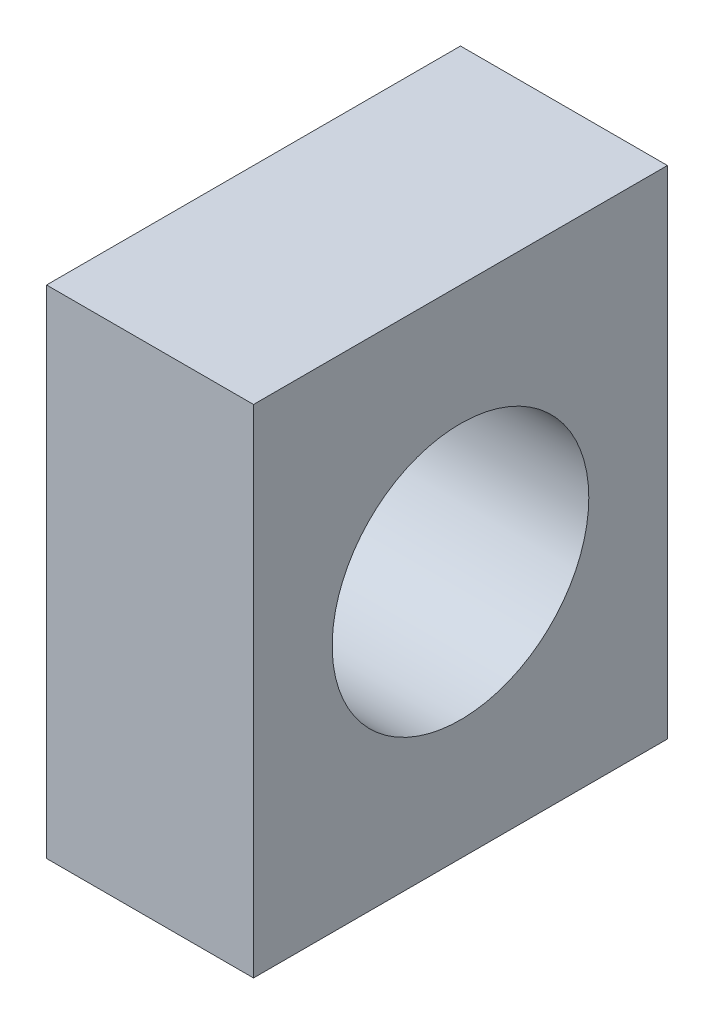
ISO-10303-21;
HEADER;
FILE_DESCRIPTION(('STEP AP214'),'2;1');
FILE_NAME('part.step','',(''),(''),'','','');
FILE_SCHEMA(('AUTOMOTIVE_DESIGN { 1 0 10303 214 1 1 1 1 }'));
ENDSEC;
DATA;
#1=APPLICATION_CONTEXT('core data for automotive mechanical design processes');
#2=APPLICATION_PROTOCOL_DEFINITION('international standard','automotive_design',2000,#1);
#3=PRODUCT_CONTEXT('',#1,'mechanical');
#4=PRODUCT('Part','Part','',(#3));
#5=PRODUCT_RELATED_PRODUCT_CATEGORY('part','',(#4));
#6=PRODUCT_DEFINITION_FORMATION('','',#4);
#7=PRODUCT_DEFINITION_CONTEXT('part definition',#1,'design');
#8=PRODUCT_DEFINITION('design','',#6,#7);
#9=PRODUCT_DEFINITION_SHAPE('','',#8);
#10=(LENGTH_UNIT() NAMED_UNIT(*) SI_UNIT(.MILLI.,.METRE.));
#11=(NAMED_UNIT(*) PLANE_ANGLE_UNIT() SI_UNIT($,.RADIAN.));
#12=(NAMED_UNIT(*) SI_UNIT($,.STERADIAN.) SOLID_ANGLE_UNIT());
#13=UNCERTAINTY_MEASURE_WITH_UNIT(LENGTH_MEASURE(1.E-05),#10,'distance_accuracy_value','');
#14=(GEOMETRIC_REPRESENTATION_CONTEXT(3) GLOBAL_UNCERTAINTY_ASSIGNED_CONTEXT((#13)) GLOBAL_UNIT_ASSIGNED_CONTEXT((#10,
#11,#12)) REPRESENTATION_CONTEXT('',''));
#15=CARTESIAN_POINT('',(0.,0.,0.));
#16=DIRECTION('',(0.,0.,1.));
#17=DIRECTION('',(1.,0.,0.));
#18=AXIS2_PLACEMENT_3D('',#15,#16,#17);
#19=CARTESIAN_POINT('',(2.5,-6.,0.));
#20=DIRECTION('',(0.,1.,0.));
#21=DIRECTION('',(0.,0.,1.));
#22=AXIS2_PLACEMENT_3D('',#19,#20,#21);
#23=PLANE('',#22);
#24=DIRECTION('',(0.,0.,-1.));
#25=VECTOR('',#24,1.);
#26=CARTESIAN_POINT('',(-2.5,-6.,0.));
#27=LINE('',#26,#25);
#28=CARTESIAN_POINT('',(-2.5,-6.,5.));
#29=VERTEX_POINT('',#28);
#30=CARTESIAN_POINT('',(-2.5,-6.,-5.));
#31=VERTEX_POINT('',#30);
#32=EDGE_CURVE('E103',#29,#31,#27,.T.);
#33=ORIENTED_EDGE('',*,*,#32,.T.);
#34=DIRECTION('',(-1.,0.,0.));
#35=VECTOR('',#34,1.);
#36=CARTESIAN_POINT('',(2.5,-6.,-5.));
#37=LINE('',#36,#35);
#38=CARTESIAN_POINT('',(2.5,-6.,-5.));
#39=VERTEX_POINT('',#38);
#40=EDGE_CURVE('E11',#39,#31,#37,.T.);
#41=ORIENTED_EDGE('',*,*,#40,.F.);
#42=DIRECTION('',(0.,0.,-1.));
#43=VECTOR('',#42,1.);
#44=CARTESIAN_POINT('',(2.5,-6.,0.));
#45=LINE('',#44,#43);
#46=CARTESIAN_POINT('',(2.5,-6.,5.));
#47=VERTEX_POINT('',#46);
#48=EDGE_CURVE('E86',#47,#39,#45,.T.);
#49=ORIENTED_EDGE('',*,*,#48,.F.);
#50=DIRECTION('',(-1.,0.,0.));
#51=VECTOR('',#50,1.);
#52=CARTESIAN_POINT('',(2.5,-6.,5.));
#53=LINE('',#52,#51);
#54=EDGE_CURVE('E53',#47,#29,#53,.T.);
#55=ORIENTED_EDGE('',*,*,#54,.T.);
#56=EDGE_LOOP('',(#33,#41,#49,#55));
#57=FACE_BOUND('',#56,.T.);
#58=ADVANCED_FACE('F36',(#57),#23,.F.);
#59=CARTESIAN_POINT('',(2.5,0.,-5.));
#60=DIRECTION('',(0.,0.,1.));
#61=DIRECTION('',(1.,0.,0.));
#62=AXIS2_PLACEMENT_3D('',#59,#60,#61);
#63=PLANE('',#62);
#64=DIRECTION('',(0.,1.,0.));
#65=VECTOR('',#64,1.);
#66=CARTESIAN_POINT('',(-2.5,0.,-5.));
#67=LINE('',#66,#65);
#68=CARTESIAN_POINT('',(-2.5,6.,-5.));
#69=VERTEX_POINT('',#68);
#70=EDGE_CURVE('E91',#31,#69,#67,.T.);
#71=ORIENTED_EDGE('',*,*,#70,.T.);
#72=DIRECTION('',(-1.,0.,0.));
#73=VECTOR('',#72,1.);
#74=CARTESIAN_POINT('',(2.5,6.,-5.));
#75=LINE('',#74,#73);
#76=CARTESIAN_POINT('',(2.5,6.,-5.));
#77=VERTEX_POINT('',#76);
#78=EDGE_CURVE('E45',#77,#69,#75,.T.);
#79=ORIENTED_EDGE('',*,*,#78,.F.);
#80=DIRECTION('',(0.,1.,0.));
#81=VECTOR('',#80,1.);
#82=CARTESIAN_POINT('',(2.5,0.,-5.));
#83=LINE('',#82,#81);
#84=EDGE_CURVE('E78',#39,#77,#83,.T.);
#85=ORIENTED_EDGE('',*,*,#84,.F.);
#86=ORIENTED_EDGE('',*,*,#40,.T.);
#87=EDGE_LOOP('',(#71,#79,#85,#86));
#88=FACE_BOUND('',#87,.T.);
#89=ADVANCED_FACE('F90',(#88),#63,.F.);
#90=CARTESIAN_POINT('',(2.5,6.,0.));
#91=DIRECTION('',(0.,1.,0.));
#92=DIRECTION('',(0.,0.,1.));
#93=AXIS2_PLACEMENT_3D('',#90,#91,#92);
#94=PLANE('',#93);
#95=DIRECTION('',(0.,0.,-1.));
#96=VECTOR('',#95,1.);
#97=CARTESIAN_POINT('',(-2.5,6.,0.));
#98=LINE('',#97,#96);
#99=CARTESIAN_POINT('',(-2.5,6.,5.));
#100=VERTEX_POINT('',#99);
#101=EDGE_CURVE('E106',#100,#69,#98,.T.);
#102=ORIENTED_EDGE('',*,*,#101,.F.);
#103=DIRECTION('',(-1.,0.,0.));
#104=VECTOR('',#103,1.);
#105=CARTESIAN_POINT('',(2.5,6.,5.));
#106=LINE('',#105,#104);
#107=CARTESIAN_POINT('',(2.5,6.,5.));
#108=VERTEX_POINT('',#107);
#109=EDGE_CURVE('E67',#108,#100,#106,.T.);
#110=ORIENTED_EDGE('',*,*,#109,.F.);
#111=DIRECTION('',(0.,0.,-1.));
#112=VECTOR('',#111,1.);
#113=CARTESIAN_POINT('',(2.5,6.,0.));
#114=LINE('',#113,#112);
#115=EDGE_CURVE('E85',#108,#77,#114,.T.);
#116=ORIENTED_EDGE('',*,*,#115,.T.);
#117=ORIENTED_EDGE('',*,*,#78,.T.);
#118=EDGE_LOOP('',(#102,#110,#116,#117));
#119=FACE_BOUND('',#118,.T.);
#120=ADVANCED_FACE('F94',(#119),#94,.T.);
#121=CARTESIAN_POINT('',(2.5,0.,0.));
#122=DIRECTION('',(-1.,0.,0.));
#123=DIRECTION('',(0.,0.,1.));
#124=AXIS2_PLACEMENT_3D('',#121,#122,#123);
#125=CYLINDRICAL_SURFACE('',#124,3.1);
#126=CARTESIAN_POINT('',(2.5,0.,0.));
#127=DIRECTION('',(1.,0.,0.));
#128=DIRECTION('',(0.,0.,-1.));
#129=AXIS2_PLACEMENT_3D('',#126,#127,#128);
#130=CIRCLE('',#129,3.1);
#131=CARTESIAN_POINT('',(2.5,0.,-3.1));
#132=VERTEX_POINT('',#131);
#133=EDGE_CURVE('E111',#132,#132,#130,.T.);
#134=ORIENTED_EDGE('',*,*,#133,.T.);
#135=EDGE_LOOP('',(#134));
#136=FACE_BOUND('',#135,.T.);
#137=CARTESIAN_POINT('',(-2.5,0.,0.));
#138=DIRECTION('',(1.,0.,0.));
#139=DIRECTION('',(0.,0.,-1.));
#140=AXIS2_PLACEMENT_3D('',#137,#138,#139);
#141=CIRCLE('',#140,3.1);
#142=CARTESIAN_POINT('',(-2.5,0.,-3.1));
#143=VERTEX_POINT('',#142);
#144=EDGE_CURVE('E100',#143,#143,#141,.T.);
#145=ORIENTED_EDGE('',*,*,#144,.F.);
#146=EDGE_LOOP('',(#145));
#147=FACE_BOUND('',#146,.T.);
#148=ADVANCED_FACE('F38',(#136,#147),#125,.F.);
#149=CARTESIAN_POINT('',(2.5,0.,5.));
#150=DIRECTION('',(0.,0.,1.));
#151=DIRECTION('',(1.,0.,0.));
#152=AXIS2_PLACEMENT_3D('',#149,#150,#151);
#153=PLANE('',#152);
#154=DIRECTION('',(0.,1.,0.));
#155=VECTOR('',#154,1.);
#156=CARTESIAN_POINT('',(-2.5,0.,5.));
#157=LINE('',#156,#155);
#158=EDGE_CURVE('E108',#29,#100,#157,.T.);
#159=ORIENTED_EDGE('',*,*,#158,.F.);
#160=ORIENTED_EDGE('',*,*,#54,.F.);
#161=DIRECTION('',(0.,1.,0.));
#162=VECTOR('',#161,1.);
#163=CARTESIAN_POINT('',(2.5,0.,5.));
#164=LINE('',#163,#162);
#165=EDGE_CURVE('E95',#47,#108,#164,.T.);
#166=ORIENTED_EDGE('',*,*,#165,.T.);
#167=ORIENTED_EDGE('',*,*,#109,.T.);
#168=EDGE_LOOP('',(#159,#160,#166,#167));
#169=FACE_BOUND('',#168,.T.);
#170=ADVANCED_FACE('F122',(#169),#153,.T.);
#171=CARTESIAN_POINT('',(2.5,0.,0.));
#172=DIRECTION('',(1.,0.,0.));
#173=DIRECTION('',(0.,0.,-1.));
#174=AXIS2_PLACEMENT_3D('',#171,#172,#173);
#175=PLANE('',#174);
#176=ORIENTED_EDGE('',*,*,#133,.F.);
#177=EDGE_LOOP('',(#176));
#178=FACE_BOUND('',#177,.T.);
#179=ORIENTED_EDGE('',*,*,#48,.T.);
#180=ORIENTED_EDGE('',*,*,#84,.T.);
#181=ORIENTED_EDGE('',*,*,#115,.F.);
#182=ORIENTED_EDGE('',*,*,#165,.F.);
#183=EDGE_LOOP('',(#179,#180,#181,#182));
#184=FACE_BOUND('',#183,.T.);
#185=ADVANCED_FACE('F82',(#178,#184),#175,.T.);
#186=CARTESIAN_POINT('',(-2.5,0.,0.));
#187=DIRECTION('',(1.,0.,0.));
#188=DIRECTION('',(0.,0.,-1.));
#189=AXIS2_PLACEMENT_3D('',#186,#187,#188);
#190=PLANE('',#189);
#191=ORIENTED_EDGE('',*,*,#144,.T.);
#192=EDGE_LOOP('',(#191));
#193=FACE_BOUND('',#192,.T.);
#194=ORIENTED_EDGE('',*,*,#32,.F.);
#195=ORIENTED_EDGE('',*,*,#158,.T.);
#196=ORIENTED_EDGE('',*,*,#101,.T.);
#197=ORIENTED_EDGE('',*,*,#70,.F.);
#198=EDGE_LOOP('',(#194,#195,#196,#197));
#199=FACE_BOUND('',#198,.T.);
#200=ADVANCED_FACE('F121',(#193,#199),#190,.F.);
#201=CLOSED_SHELL('',(#58,#89,#120,#148,#170,#185,#200));
#202=MANIFOLD_SOLID_BREP('B2',#201);
#203=ADVANCED_BREP_SHAPE_REPRESENTATION('',(#18,#202),#14);
#204=SHAPE_DEFINITION_REPRESENTATION(#9,#203);
ENDSEC;
END-ISO-10303-21;
